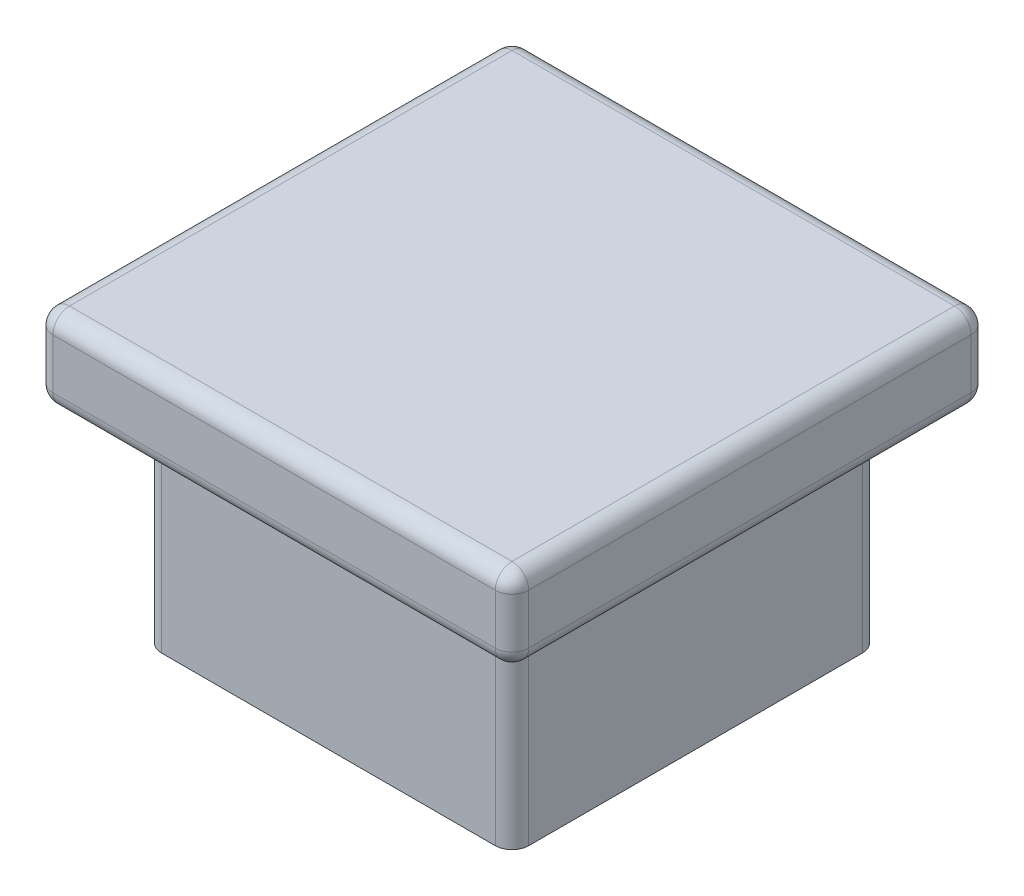
ISO-10303-21;
HEADER;
FILE_DESCRIPTION(('STEP AP214'),'2;1');
FILE_NAME('part.step','',(''),(''),'','','');
FILE_SCHEMA(('AUTOMOTIVE_DESIGN { 1 0 10303 214 1 1 1 1 }'));
ENDSEC;
DATA;
#1=APPLICATION_CONTEXT('core data for automotive mechanical design processes');
#2=APPLICATION_PROTOCOL_DEFINITION('international standard','automotive_design',2000,#1);
#3=PRODUCT_CONTEXT('',#1,'mechanical');
#4=PRODUCT('Part','Part','',(#3));
#5=PRODUCT_RELATED_PRODUCT_CATEGORY('part','',(#4));
#6=PRODUCT_DEFINITION_FORMATION('','',#4);
#7=PRODUCT_DEFINITION_CONTEXT('part definition',#1,'design');
#8=PRODUCT_DEFINITION('design','',#6,#7);
#9=PRODUCT_DEFINITION_SHAPE('','',#8);
#10=(LENGTH_UNIT() NAMED_UNIT(*) SI_UNIT(.MILLI.,.METRE.));
#11=(NAMED_UNIT(*) PLANE_ANGLE_UNIT() SI_UNIT($,.RADIAN.));
#12=(NAMED_UNIT(*) SI_UNIT($,.STERADIAN.) SOLID_ANGLE_UNIT());
#13=UNCERTAINTY_MEASURE_WITH_UNIT(LENGTH_MEASURE(1.E-05),#10,'distance_accuracy_value','');
#14=(GEOMETRIC_REPRESENTATION_CONTEXT(3) GLOBAL_UNCERTAINTY_ASSIGNED_CONTEXT((#13)) GLOBAL_UNIT_ASSIGNED_CONTEXT((#10,
#11,#12)) REPRESENTATION_CONTEXT('',''));
#15=CARTESIAN_POINT('',(0.,0.,0.));
#16=DIRECTION('',(0.,0.,1.));
#17=DIRECTION('',(1.,0.,0.));
#18=AXIS2_PLACEMENT_3D('',#15,#16,#17);
#19=CARTESIAN_POINT('',(0.,0.,0.));
#20=DIRECTION('',(0.,-1.,0.));
#21=DIRECTION('',(0.,0.,-1.));
#22=AXIS2_PLACEMENT_3D('',#19,#20,#21);
#23=PLANE('',#22);
#24=DIRECTION('',(0.,0.,-1.));
#25=VECTOR('',#24,1.);
#26=CARTESIAN_POINT('',(22.,0.,22.));
#27=LINE('',#26,#25);
#28=CARTESIAN_POINT('',(22.,0.,20.));
#29=VERTEX_POINT('',#28);
#30=CARTESIAN_POINT('',(22.,0.,-20.));
#31=VERTEX_POINT('',#30);
#32=EDGE_CURVE('E334',#29,#31,#27,.T.);
#33=ORIENTED_EDGE('',*,*,#32,.F.);
#34=CARTESIAN_POINT('',(20.,0.,20.));
#35=DIRECTION('',(0.,-1.,0.));
#36=DIRECTION('',(0.,0.,-1.));
#37=AXIS2_PLACEMENT_3D('',#34,#35,#36);
#38=CIRCLE('',#37,2.);
#39=CARTESIAN_POINT('',(20.,0.,22.));
#40=VERTEX_POINT('',#39);
#41=EDGE_CURVE('E443',#29,#40,#38,.T.);
#42=ORIENTED_EDGE('',*,*,#41,.T.);
#43=DIRECTION('',(1.,0.,0.));
#44=VECTOR('',#43,1.);
#45=CARTESIAN_POINT('',(-22.,0.,22.));
#46=LINE('',#45,#44);
#47=CARTESIAN_POINT('',(-20.,0.,22.));
#48=VERTEX_POINT('',#47);
#49=EDGE_CURVE('E345',#48,#40,#46,.T.);
#50=ORIENTED_EDGE('',*,*,#49,.F.);
#51=CARTESIAN_POINT('',(-20.,0.,20.));
#52=DIRECTION('',(0.,-1.,0.));
#53=DIRECTION('',(0.,0.,-1.));
#54=AXIS2_PLACEMENT_3D('',#51,#52,#53);
#55=CIRCLE('',#54,2.);
#56=CARTESIAN_POINT('',(-22.,0.,20.));
#57=VERTEX_POINT('',#56);
#58=EDGE_CURVE('E440',#48,#57,#55,.T.);
#59=ORIENTED_EDGE('',*,*,#58,.T.);
#60=DIRECTION('',(0.,0.,1.));
#61=VECTOR('',#60,1.);
#62=CARTESIAN_POINT('',(-22.,0.,22.));
#63=LINE('',#62,#61);
#64=CARTESIAN_POINT('',(-22.,0.,-20.));
#65=VERTEX_POINT('',#64);
#66=EDGE_CURVE('E341',#65,#57,#63,.T.);
#67=ORIENTED_EDGE('',*,*,#66,.F.);
#68=CARTESIAN_POINT('',(-20.,0.,-20.));
#69=DIRECTION('',(0.,-1.,0.));
#70=DIRECTION('',(0.,0.,-1.));
#71=AXIS2_PLACEMENT_3D('',#68,#69,#70);
#72=CIRCLE('',#71,2.);
#73=CARTESIAN_POINT('',(-20.,0.,-22.));
#74=VERTEX_POINT('',#73);
#75=EDGE_CURVE('E434',#65,#74,#72,.T.);
#76=ORIENTED_EDGE('',*,*,#75,.T.);
#77=DIRECTION('',(-1.,0.,0.));
#78=VECTOR('',#77,1.);
#79=CARTESIAN_POINT('',(-22.,0.,-22.));
#80=LINE('',#79,#78);
#81=CARTESIAN_POINT('',(20.,0.,-22.));
#82=VERTEX_POINT('',#81);
#83=EDGE_CURVE('E338',#82,#74,#80,.T.);
#84=ORIENTED_EDGE('',*,*,#83,.F.);
#85=CARTESIAN_POINT('',(20.,0.,-20.));
#86=DIRECTION('',(0.,-1.,0.));
#87=DIRECTION('',(0.,0.,-1.));
#88=AXIS2_PLACEMENT_3D('',#85,#86,#87);
#89=CIRCLE('',#88,2.);
#90=EDGE_CURVE('E437',#82,#31,#89,.T.);
#91=ORIENTED_EDGE('',*,*,#90,.T.);
#92=EDGE_LOOP('',(#33,#42,#50,#59,#67,#76,#84,#91));
#93=FACE_BOUND('',#92,.T.);
#94=DIRECTION('',(1.,0.,0.));
#95=VECTOR('',#94,1.);
#96=CARTESIAN_POINT('',(-19.,0.,19.));
#97=LINE('',#96,#95);
#98=CARTESIAN_POINT('',(-19.,0.,19.));
#99=VERTEX_POINT('',#98);
#100=CARTESIAN_POINT('',(19.,0.,19.));
#101=VERTEX_POINT('',#100);
#102=EDGE_CURVE('E294',#99,#101,#97,.T.);
#103=ORIENTED_EDGE('',*,*,#102,.T.);
#104=DIRECTION('',(0.,0.,-1.));
#105=VECTOR('',#104,1.);
#106=CARTESIAN_POINT('',(19.,0.,19.));
#107=LINE('',#106,#105);
#108=CARTESIAN_POINT('',(19.,0.,-19.));
#109=VERTEX_POINT('',#108);
#110=EDGE_CURVE('E283',#101,#109,#107,.T.);
#111=ORIENTED_EDGE('',*,*,#110,.T.);
#112=DIRECTION('',(-1.,0.,0.));
#113=VECTOR('',#112,1.);
#114=CARTESIAN_POINT('',(-19.,0.,-19.));
#115=LINE('',#114,#113);
#116=CARTESIAN_POINT('',(-19.,0.,-19.));
#117=VERTEX_POINT('',#116);
#118=EDGE_CURVE('E310',#109,#117,#115,.T.);
#119=ORIENTED_EDGE('',*,*,#118,.T.);
#120=DIRECTION('',(0.,0.,1.));
#121=VECTOR('',#120,1.);
#122=CARTESIAN_POINT('',(-19.,0.,19.));
#123=LINE('',#122,#121);
#124=EDGE_CURVE('E314',#117,#99,#123,.T.);
#125=ORIENTED_EDGE('',*,*,#124,.T.);
#126=EDGE_LOOP('',(#103,#111,#119,#125));
#127=FACE_BOUND('',#126,.T.);
#128=ADVANCED_FACE('F43',(#93,#127),#23,.T.);
#129=CARTESIAN_POINT('',(22.,25.,22.));
#130=DIRECTION('',(-1.,0.,0.));
#131=DIRECTION('',(0.,0.,1.));
#132=AXIS2_PLACEMENT_3D('',#129,#130,#131);
#133=PLANE('',#132);
#134=DIRECTION('',(0.,0.,1.));
#135=VECTOR('',#134,1.);
#136=CARTESIAN_POINT('',(22.,29.,-22.));
#137=LINE('',#136,#135);
#138=CARTESIAN_POINT('',(22.,29.,-20.));
#139=VERTEX_POINT('',#138);
#140=CARTESIAN_POINT('',(22.,29.,20.));
#141=VERTEX_POINT('',#140);
#142=EDGE_CURVE('E564',#139,#141,#137,.T.);
#143=ORIENTED_EDGE('',*,*,#142,.T.);
#144=DIRECTION('',(0.,-1.,0.));
#145=VECTOR('',#144,1.);
#146=CARTESIAN_POINT('',(22.,25.,20.));
#147=LINE('',#146,#145);
#148=EDGE_CURVE('E430',#141,#29,#147,.T.);
#149=ORIENTED_EDGE('',*,*,#148,.T.);
#150=ORIENTED_EDGE('',*,*,#32,.T.);
#151=DIRECTION('',(0.,-1.,0.));
#152=VECTOR('',#151,1.);
#153=CARTESIAN_POINT('',(22.,25.,-20.));
#154=LINE('',#153,#152);
#155=EDGE_CURVE('E427',#31,#139,#154,.F.);
#156=ORIENTED_EDGE('',*,*,#155,.T.);
#157=EDGE_LOOP('',(#143,#149,#150,#156));
#158=FACE_BOUND('',#157,.T.);
#159=ADVANCED_FACE('F596',(#158),#133,.F.);
#160=CARTESIAN_POINT('',(-22.,25.,-22.));
#161=DIRECTION('',(0.,0.,1.));
#162=DIRECTION('',(1.,0.,0.));
#163=AXIS2_PLACEMENT_3D('',#160,#161,#162);
#164=PLANE('',#163);
#165=DIRECTION('',(1.,0.,0.));
#166=VECTOR('',#165,1.);
#167=CARTESIAN_POINT('',(-22.,29.,-22.));
#168=LINE('',#167,#166);
#169=CARTESIAN_POINT('',(-20.,29.,-22.));
#170=VERTEX_POINT('',#169);
#171=CARTESIAN_POINT('',(20.,29.,-22.));
#172=VERTEX_POINT('',#171);
#173=EDGE_CURVE('E265',#170,#172,#168,.T.);
#174=ORIENTED_EDGE('',*,*,#173,.T.);
#175=DIRECTION('',(0.,-1.,0.));
#176=VECTOR('',#175,1.);
#177=CARTESIAN_POINT('',(20.,25.,-22.));
#178=LINE('',#177,#176);
#179=EDGE_CURVE('E462',#172,#82,#178,.T.);
#180=ORIENTED_EDGE('',*,*,#179,.T.);
#181=ORIENTED_EDGE('',*,*,#83,.T.);
#182=DIRECTION('',(0.,-1.,0.));
#183=VECTOR('',#182,1.);
#184=CARTESIAN_POINT('',(-20.,25.,-22.));
#185=LINE('',#184,#183);
#186=EDGE_CURVE('E67',#74,#170,#185,.F.);
#187=ORIENTED_EDGE('',*,*,#186,.T.);
#188=EDGE_LOOP('',(#174,#180,#181,#187));
#189=FACE_BOUND('',#188,.T.);
#190=ADVANCED_FACE('F587',(#189),#164,.F.);
#191=CARTESIAN_POINT('',(-22.,25.,22.));
#192=DIRECTION('',(1.,0.,0.));
#193=DIRECTION('',(0.,0.,-1.));
#194=AXIS2_PLACEMENT_3D('',#191,#192,#193);
#195=PLANE('',#194);
#196=ORIENTED_EDGE('',*,*,#66,.T.);
#197=DIRECTION('',(0.,-1.,0.));
#198=VECTOR('',#197,1.);
#199=CARTESIAN_POINT('',(-22.,25.,20.));
#200=LINE('',#199,#198);
#201=CARTESIAN_POINT('',(-22.,29.,20.));
#202=VERTEX_POINT('',#201);
#203=EDGE_CURVE('E457',#57,#202,#200,.F.);
#204=ORIENTED_EDGE('',*,*,#203,.T.);
#205=DIRECTION('',(0.,0.,-1.));
#206=VECTOR('',#205,1.);
#207=CARTESIAN_POINT('',(-22.,29.,-22.));
#208=LINE('',#207,#206);
#209=CARTESIAN_POINT('',(-22.,29.,-20.));
#210=VERTEX_POINT('',#209);
#211=EDGE_CURVE('E578',#202,#210,#208,.T.);
#212=ORIENTED_EDGE('',*,*,#211,.T.);
#213=DIRECTION('',(0.,-1.,0.));
#214=VECTOR('',#213,1.);
#215=CARTESIAN_POINT('',(-22.,25.,-20.));
#216=LINE('',#215,#214);
#217=EDGE_CURVE('E453',#210,#65,#216,.T.);
#218=ORIENTED_EDGE('',*,*,#217,.T.);
#219=EDGE_LOOP('',(#196,#204,#212,#218));
#220=FACE_BOUND('',#219,.T.);
#221=ADVANCED_FACE('F611',(#220),#195,.F.);
#222=CARTESIAN_POINT('',(-22.,25.,22.));
#223=DIRECTION('',(0.,0.,-1.));
#224=DIRECTION('',(-1.,0.,0.));
#225=AXIS2_PLACEMENT_3D('',#222,#223,#224);
#226=PLANE('',#225);
#227=ORIENTED_EDGE('',*,*,#49,.T.);
#228=DIRECTION('',(0.,-1.,0.));
#229=VECTOR('',#228,1.);
#230=CARTESIAN_POINT('',(20.,25.,22.));
#231=LINE('',#230,#229);
#232=CARTESIAN_POINT('',(20.,29.,22.));
#233=VERTEX_POINT('',#232);
#234=EDGE_CURVE('E450',#40,#233,#231,.F.);
#235=ORIENTED_EDGE('',*,*,#234,.T.);
#236=DIRECTION('',(-1.,0.,0.));
#237=VECTOR('',#236,1.);
#238=CARTESIAN_POINT('',(-22.,29.,22.));
#239=LINE('',#238,#237);
#240=CARTESIAN_POINT('',(-20.,29.,22.));
#241=VERTEX_POINT('',#240);
#242=EDGE_CURVE('E572',#233,#241,#239,.T.);
#243=ORIENTED_EDGE('',*,*,#242,.T.);
#244=DIRECTION('',(0.,-1.,0.));
#245=VECTOR('',#244,1.);
#246=CARTESIAN_POINT('',(-20.,25.,22.));
#247=LINE('',#246,#245);
#248=EDGE_CURVE('E446',#241,#48,#247,.T.);
#249=ORIENTED_EDGE('',*,*,#248,.T.);
#250=EDGE_LOOP('',(#227,#235,#243,#249));
#251=FACE_BOUND('',#250,.T.);
#252=ADVANCED_FACE('F603',(#251),#226,.F.);
#253=CARTESIAN_POINT('',(19.,25.,19.));
#254=DIRECTION('',(-1.,0.,0.));
#255=DIRECTION('',(0.,0.,1.));
#256=AXIS2_PLACEMENT_3D('',#253,#254,#255);
#257=PLANE('',#256);
#258=ORIENTED_EDGE('',*,*,#110,.F.);
#259=DIRECTION('',(0.,-1.,0.));
#260=VECTOR('',#259,1.);
#261=CARTESIAN_POINT('',(19.,25.,19.));
#262=LINE('',#261,#260);
#263=CARTESIAN_POINT('',(19.,25.,19.));
#264=VERTEX_POINT('',#263);
#265=EDGE_CURVE('E306',#264,#101,#262,.T.);
#266=ORIENTED_EDGE('',*,*,#265,.F.);
#267=DIRECTION('',(0.,0.,-1.));
#268=VECTOR('',#267,1.);
#269=CARTESIAN_POINT('',(19.,25.,19.));
#270=LINE('',#269,#268);
#271=CARTESIAN_POINT('',(19.,25.,-19.));
#272=VERTEX_POINT('',#271);
#273=EDGE_CURVE('E289',#264,#272,#270,.T.);
#274=ORIENTED_EDGE('',*,*,#273,.T.);
#275=DIRECTION('',(0.,-1.,0.));
#276=VECTOR('',#275,1.);
#277=CARTESIAN_POINT('',(19.,25.,-19.));
#278=LINE('',#277,#276);
#279=EDGE_CURVE('E330',#272,#109,#278,.T.);
#280=ORIENTED_EDGE('',*,*,#279,.T.);
#281=EDGE_LOOP('',(#258,#266,#274,#280));
#282=FACE_BOUND('',#281,.T.);
#283=ADVANCED_FACE('F634',(#282),#257,.T.);
#284=CARTESIAN_POINT('',(-19.,25.,-19.));
#285=DIRECTION('',(0.,0.,1.));
#286=DIRECTION('',(1.,0.,0.));
#287=AXIS2_PLACEMENT_3D('',#284,#285,#286);
#288=PLANE('',#287);
#289=ORIENTED_EDGE('',*,*,#118,.F.);
#290=ORIENTED_EDGE('',*,*,#279,.F.);
#291=DIRECTION('',(-1.,0.,0.));
#292=VECTOR('',#291,1.);
#293=CARTESIAN_POINT('',(-19.,25.,-19.));
#294=LINE('',#293,#292);
#295=CARTESIAN_POINT('',(-19.,25.,-19.));
#296=VERTEX_POINT('',#295);
#297=EDGE_CURVE('E293',#272,#296,#294,.T.);
#298=ORIENTED_EDGE('',*,*,#297,.T.);
#299=DIRECTION('',(0.,-1.,0.));
#300=VECTOR('',#299,1.);
#301=CARTESIAN_POINT('',(-19.,25.,-19.));
#302=LINE('',#301,#300);
#303=EDGE_CURVE('E327',#296,#117,#302,.T.);
#304=ORIENTED_EDGE('',*,*,#303,.T.);
#305=EDGE_LOOP('',(#289,#290,#298,#304));
#306=FACE_BOUND('',#305,.T.);
#307=ADVANCED_FACE('F1056',(#306),#288,.T.);
#308=CARTESIAN_POINT('',(-19.,25.,19.));
#309=DIRECTION('',(1.,0.,0.));
#310=DIRECTION('',(0.,0.,-1.));
#311=AXIS2_PLACEMENT_3D('',#308,#309,#310);
#312=PLANE('',#311);
#313=ORIENTED_EDGE('',*,*,#124,.F.);
#314=ORIENTED_EDGE('',*,*,#303,.F.);
#315=DIRECTION('',(0.,0.,1.));
#316=VECTOR('',#315,1.);
#317=CARTESIAN_POINT('',(-19.,25.,19.));
#318=LINE('',#317,#316);
#319=CARTESIAN_POINT('',(-19.,25.,19.));
#320=VERTEX_POINT('',#319);
#321=EDGE_CURVE('E298',#296,#320,#318,.T.);
#322=ORIENTED_EDGE('',*,*,#321,.T.);
#323=DIRECTION('',(0.,-1.,0.));
#324=VECTOR('',#323,1.);
#325=CARTESIAN_POINT('',(-19.,25.,19.));
#326=LINE('',#325,#324);
#327=EDGE_CURVE('E324',#320,#99,#326,.T.);
#328=ORIENTED_EDGE('',*,*,#327,.T.);
#329=EDGE_LOOP('',(#313,#314,#322,#328));
#330=FACE_BOUND('',#329,.T.);
#331=ADVANCED_FACE('F1045',(#330),#312,.T.);
#332=CARTESIAN_POINT('',(-19.,25.,19.));
#333=DIRECTION('',(0.,0.,-1.));
#334=DIRECTION('',(-1.,0.,0.));
#335=AXIS2_PLACEMENT_3D('',#332,#333,#334);
#336=PLANE('',#335);
#337=ORIENTED_EDGE('',*,*,#102,.F.);
#338=ORIENTED_EDGE('',*,*,#327,.F.);
#339=DIRECTION('',(1.,0.,0.));
#340=VECTOR('',#339,1.);
#341=CARTESIAN_POINT('',(-19.,25.,19.));
#342=LINE('',#341,#340);
#343=EDGE_CURVE('E302',#320,#264,#342,.T.);
#344=ORIENTED_EDGE('',*,*,#343,.T.);
#345=ORIENTED_EDGE('',*,*,#265,.T.);
#346=EDGE_LOOP('',(#337,#338,#344,#345));
#347=FACE_BOUND('',#346,.T.);
#348=ADVANCED_FACE('F1035',(#347),#336,.T.);
#349=CARTESIAN_POINT('',(0.,25.,0.));
#350=DIRECTION('',(0.,-1.,0.));
#351=DIRECTION('',(0.,0.,-1.));
#352=AXIS2_PLACEMENT_3D('',#349,#350,#351);
#353=PLANE('',#352);
#354=ORIENTED_EDGE('',*,*,#273,.F.);
#355=ORIENTED_EDGE('',*,*,#343,.F.);
#356=ORIENTED_EDGE('',*,*,#321,.F.);
#357=ORIENTED_EDGE('',*,*,#297,.F.);
#358=EDGE_LOOP('',(#354,#355,#356,#357));
#359=FACE_BOUND('',#358,.T.);
#360=ADVANCED_FACE('F903',(#359),#353,.T.);
#361=CARTESIAN_POINT('',(25.75,29.,-25.75));
#362=DIRECTION('',(1.,0.,0.));
#363=DIRECTION('',(0.,0.,-1.));
#364=AXIS2_PLACEMENT_3D('',#361,#362,#363);
#365=PLANE('',#364);
#366=DIRECTION('',(0.,0.,1.));
#367=VECTOR('',#366,1.);
#368=CARTESIAN_POINT('',(25.75,25.,-25.75));
#369=LINE('',#368,#367);
#370=CARTESIAN_POINT('',(25.75,25.,-25.75));
#371=VERTEX_POINT('',#370);
#372=CARTESIAN_POINT('',(25.75,25.,25.75));
#373=VERTEX_POINT('',#372);
#374=EDGE_CURVE('E238',#371,#373,#369,.T.);
#375=ORIENTED_EDGE('',*,*,#374,.T.);
#376=DIRECTION('',(0.,-1.,0.));
#377=VECTOR('',#376,1.);
#378=CARTESIAN_POINT('',(25.75,29.,25.75));
#379=LINE('',#378,#377);
#380=CARTESIAN_POINT('',(25.75,29.,25.75));
#381=VERTEX_POINT('',#380);
#382=EDGE_CURVE('E231',#381,#373,#379,.T.);
#383=ORIENTED_EDGE('',*,*,#382,.F.);
#384=DIRECTION('',(0.,0.,1.));
#385=VECTOR('',#384,1.);
#386=CARTESIAN_POINT('',(25.75,29.,-25.75));
#387=LINE('',#386,#385);
#388=CARTESIAN_POINT('',(25.75,29.,-25.75));
#389=VERTEX_POINT('',#388);
#390=EDGE_CURVE('E235',#389,#381,#387,.T.);
#391=ORIENTED_EDGE('',*,*,#390,.F.);
#392=DIRECTION('',(0.,-1.,0.));
#393=VECTOR('',#392,1.);
#394=CARTESIAN_POINT('',(25.75,29.,-25.75));
#395=LINE('',#394,#393);
#396=EDGE_CURVE('E280',#389,#371,#395,.T.);
#397=ORIENTED_EDGE('',*,*,#396,.T.);
#398=EDGE_LOOP('',(#375,#383,#391,#397));
#399=FACE_BOUND('',#398,.T.);
#400=ADVANCED_FACE('F233',(#399),#365,.F.);
#401=CARTESIAN_POINT('',(-25.75,29.,-25.75));
#402=DIRECTION('',(0.,0.,-1.));
#403=DIRECTION('',(-1.,0.,0.));
#404=AXIS2_PLACEMENT_3D('',#401,#402,#403);
#405=PLANE('',#404);
#406=DIRECTION('',(1.,0.,0.));
#407=VECTOR('',#406,1.);
#408=CARTESIAN_POINT('',(-25.75,25.,-25.75));
#409=LINE('',#408,#407);
#410=CARTESIAN_POINT('',(-25.75,25.,-25.75));
#411=VERTEX_POINT('',#410);
#412=EDGE_CURVE('E258',#411,#371,#409,.T.);
#413=ORIENTED_EDGE('',*,*,#412,.T.);
#414=ORIENTED_EDGE('',*,*,#396,.F.);
#415=DIRECTION('',(1.,0.,0.));
#416=VECTOR('',#415,1.);
#417=CARTESIAN_POINT('',(-25.75,29.,-25.75));
#418=LINE('',#417,#416);
#419=CARTESIAN_POINT('',(-25.75,29.,-25.75));
#420=VERTEX_POINT('',#419);
#421=EDGE_CURVE('E244',#420,#389,#418,.T.);
#422=ORIENTED_EDGE('',*,*,#421,.F.);
#423=DIRECTION('',(0.,-1.,0.));
#424=VECTOR('',#423,1.);
#425=CARTESIAN_POINT('',(-25.75,29.,-25.75));
#426=LINE('',#425,#424);
#427=EDGE_CURVE('E284',#420,#411,#426,.T.);
#428=ORIENTED_EDGE('',*,*,#427,.T.);
#429=EDGE_LOOP('',(#413,#414,#422,#428));
#430=FACE_BOUND('',#429,.T.);
#431=ADVANCED_FACE('F1008',(#430),#405,.F.);
#432=CARTESIAN_POINT('',(-25.75,29.,-25.75));
#433=DIRECTION('',(-1.,0.,0.));
#434=DIRECTION('',(0.,0.,1.));
#435=AXIS2_PLACEMENT_3D('',#432,#433,#434);
#436=PLANE('',#435);
#437=DIRECTION('',(0.,0.,-1.));
#438=VECTOR('',#437,1.);
#439=CARTESIAN_POINT('',(-25.75,25.,-25.75));
#440=LINE('',#439,#438);
#441=CARTESIAN_POINT('',(-25.75,25.,25.75));
#442=VERTEX_POINT('',#441);
#443=EDGE_CURVE('E262',#442,#411,#440,.T.);
#444=ORIENTED_EDGE('',*,*,#443,.T.);
#445=ORIENTED_EDGE('',*,*,#427,.F.);
#446=DIRECTION('',(0.,0.,-1.));
#447=VECTOR('',#446,1.);
#448=CARTESIAN_POINT('',(-25.75,29.,-25.75));
#449=LINE('',#448,#447);
#450=CARTESIAN_POINT('',(-25.75,29.,25.75));
#451=VERTEX_POINT('',#450);
#452=EDGE_CURVE('E253',#451,#420,#449,.T.);
#453=ORIENTED_EDGE('',*,*,#452,.F.);
#454=DIRECTION('',(0.,-1.,0.));
#455=VECTOR('',#454,1.);
#456=CARTESIAN_POINT('',(-25.75,29.,25.75));
#457=LINE('',#456,#455);
#458=EDGE_CURVE('E243',#451,#442,#457,.T.);
#459=ORIENTED_EDGE('',*,*,#458,.T.);
#460=EDGE_LOOP('',(#444,#445,#453,#459));
#461=FACE_BOUND('',#460,.T.);
#462=ADVANCED_FACE('F623',(#461),#436,.F.);
#463=CARTESIAN_POINT('',(-25.75,29.,25.75));
#464=DIRECTION('',(0.,0.,1.));
#465=DIRECTION('',(1.,0.,0.));
#466=AXIS2_PLACEMENT_3D('',#463,#464,#465);
#467=PLANE('',#466);
#468=DIRECTION('',(-1.,0.,0.));
#469=VECTOR('',#468,1.);
#470=CARTESIAN_POINT('',(-25.75,25.,25.75));
#471=LINE('',#470,#469);
#472=EDGE_CURVE('E274',#373,#442,#471,.T.);
#473=ORIENTED_EDGE('',*,*,#472,.T.);
#474=ORIENTED_EDGE('',*,*,#458,.F.);
#475=DIRECTION('',(-1.,0.,0.));
#476=VECTOR('',#475,1.);
#477=CARTESIAN_POINT('',(-25.75,29.,25.75));
#478=LINE('',#477,#476);
#479=EDGE_CURVE('E247',#381,#451,#478,.T.);
#480=ORIENTED_EDGE('',*,*,#479,.F.);
#481=ORIENTED_EDGE('',*,*,#382,.T.);
#482=EDGE_LOOP('',(#473,#474,#480,#481));
#483=FACE_BOUND('',#482,.T.);
#484=ADVANCED_FACE('F248',(#483),#467,.F.);
#485=CARTESIAN_POINT('',(0.,29.,0.));
#486=DIRECTION('',(0.,1.,0.));
#487=DIRECTION('',(0.,0.,1.));
#488=AXIS2_PLACEMENT_3D('',#485,#486,#487);
#489=PLANE('',#488);
#490=ORIENTED_EDGE('',*,*,#142,.F.);
#491=CARTESIAN_POINT('',(20.,29.,-20.));
#492=DIRECTION('',(0.,1.,0.));
#493=DIRECTION('',(0.,0.,1.));
#494=AXIS2_PLACEMENT_3D('',#491,#492,#493);
#495=CIRCLE('',#494,2.);
#496=EDGE_CURVE('E53',#139,#172,#495,.T.);
#497=ORIENTED_EDGE('',*,*,#496,.T.);
#498=ORIENTED_EDGE('',*,*,#173,.F.);
#499=CARTESIAN_POINT('',(-20.,29.,-20.));
#500=DIRECTION('',(0.,1.,0.));
#501=DIRECTION('',(0.,0.,1.));
#502=AXIS2_PLACEMENT_3D('',#499,#500,#501);
#503=CIRCLE('',#502,2.);
#504=EDGE_CURVE('E11',#170,#210,#503,.T.);
#505=ORIENTED_EDGE('',*,*,#504,.T.);
#506=ORIENTED_EDGE('',*,*,#211,.F.);
#507=CARTESIAN_POINT('',(-20.,29.,20.));
#508=DIRECTION('',(0.,1.,0.));
#509=DIRECTION('',(0.,0.,1.));
#510=AXIS2_PLACEMENT_3D('',#507,#508,#509);
#511=CIRCLE('',#510,2.);
#512=EDGE_CURVE('E469',#202,#241,#511,.T.);
#513=ORIENTED_EDGE('',*,*,#512,.T.);
#514=ORIENTED_EDGE('',*,*,#242,.F.);
#515=CARTESIAN_POINT('',(20.,29.,20.));
#516=DIRECTION('',(0.,1.,0.));
#517=DIRECTION('',(0.,0.,1.));
#518=AXIS2_PLACEMENT_3D('',#515,#516,#517);
#519=CIRCLE('',#518,2.);
#520=EDGE_CURVE('E466',#233,#141,#519,.T.);
#521=ORIENTED_EDGE('',*,*,#520,.T.);
#522=EDGE_LOOP('',(#490,#497,#498,#505,#506,#513,#514,#521));
#523=FACE_BOUND('',#522,.T.);
#524=ORIENTED_EDGE('',*,*,#390,.T.);
#525=ORIENTED_EDGE('',*,*,#479,.T.);
#526=ORIENTED_EDGE('',*,*,#452,.T.);
#527=ORIENTED_EDGE('',*,*,#421,.T.);
#528=EDGE_LOOP('',(#524,#525,#526,#527));
#529=FACE_BOUND('',#528,.T.);
#530=ADVANCED_FACE('F255',(#523,#529),#489,.F.);
#531=CARTESIAN_POINT('',(0.,35.,0.));
#532=DIRECTION('',(0.,-1.,0.));
#533=DIRECTION('',(0.,0.,-1.));
#534=AXIS2_PLACEMENT_3D('',#531,#532,#533);
#535=PLANE('',#534);
#536=DIRECTION('',(0.,0.,1.));
#537=VECTOR('',#536,1.);
#538=CARTESIAN_POINT('',(-26.5,35.,0.));
#539=LINE('',#538,#537);
#540=CARTESIAN_POINT('',(-26.5,35.,-26.5));
#541=VERTEX_POINT('',#540);
#542=CARTESIAN_POINT('',(-26.5,35.,26.5));
#543=VERTEX_POINT('',#542);
#544=EDGE_CURVE('E355',#541,#543,#539,.T.);
#545=ORIENTED_EDGE('',*,*,#544,.T.);
#546=DIRECTION('',(1.,0.,0.));
#547=VECTOR('',#546,1.);
#548=CARTESIAN_POINT('',(0.,35.,26.5));
#549=LINE('',#548,#547);
#550=CARTESIAN_POINT('',(26.5,35.,26.5));
#551=VERTEX_POINT('',#550);
#552=EDGE_CURVE('E358',#543,#551,#549,.T.);
#553=ORIENTED_EDGE('',*,*,#552,.T.);
#554=DIRECTION('',(0.,0.,-1.));
#555=VECTOR('',#554,1.);
#556=CARTESIAN_POINT('',(26.5,35.,0.));
#557=LINE('',#556,#555);
#558=CARTESIAN_POINT('',(26.5,35.,-26.5));
#559=VERTEX_POINT('',#558);
#560=EDGE_CURVE('E349',#551,#559,#557,.T.);
#561=ORIENTED_EDGE('',*,*,#560,.T.);
#562=DIRECTION('',(-1.,0.,0.));
#563=VECTOR('',#562,1.);
#564=CARTESIAN_POINT('',(0.,35.,-26.5));
#565=LINE('',#564,#563);
#566=EDGE_CURVE('E352',#559,#541,#565,.T.);
#567=ORIENTED_EDGE('',*,*,#566,.T.);
#568=EDGE_LOOP('',(#545,#553,#561,#567));
#569=FACE_BOUND('',#568,.T.);
#570=ADVANCED_FACE('F614',(#569),#535,.F.);
#571=CARTESIAN_POINT('',(-28.5,35.,-28.5));
#572=DIRECTION('',(0.,0.,1.));
#573=DIRECTION('',(1.,0.,0.));
#574=AXIS2_PLACEMENT_3D('',#571,#572,#573);
#575=PLANE('',#574);
#576=DIRECTION('',(-1.,0.,0.));
#577=VECTOR('',#576,1.);
#578=CARTESIAN_POINT('',(-28.5,27.,-28.5));
#579=LINE('',#578,#577);
#580=CARTESIAN_POINT('',(26.5,27.,-28.5));
#581=VERTEX_POINT('',#580);
#582=CARTESIAN_POINT('',(-26.5,27.,-28.5));
#583=VERTEX_POINT('',#582);
#584=EDGE_CURVE('E391',#581,#583,#579,.T.);
#585=ORIENTED_EDGE('',*,*,#584,.T.);
#586=DIRECTION('',(0.,-1.,0.));
#587=VECTOR('',#586,1.);
#588=CARTESIAN_POINT('',(-26.5,35.,-28.5));
#589=LINE('',#588,#587);
#590=CARTESIAN_POINT('',(-26.5,33.,-28.5));
#591=VERTEX_POINT('',#590);
#592=EDGE_CURVE('E398',#583,#591,#589,.F.);
#593=ORIENTED_EDGE('',*,*,#592,.T.);
#594=DIRECTION('',(-1.,0.,0.));
#595=VECTOR('',#594,1.);
#596=CARTESIAN_POINT('',(-28.5,33.,-28.5));
#597=LINE('',#596,#595);
#598=CARTESIAN_POINT('',(26.5,33.,-28.5));
#599=VERTEX_POINT('',#598);
#600=EDGE_CURVE('E394',#591,#599,#597,.F.);
#601=ORIENTED_EDGE('',*,*,#600,.T.);
#602=DIRECTION('',(0.,-1.,0.));
#603=VECTOR('',#602,1.);
#604=CARTESIAN_POINT('',(26.5,35.,-28.5));
#605=LINE('',#604,#603);
#606=EDGE_CURVE('E388',#599,#581,#605,.T.);
#607=ORIENTED_EDGE('',*,*,#606,.T.);
#608=EDGE_LOOP('',(#585,#593,#601,#607));
#609=FACE_BOUND('',#608,.T.);
#610=ADVANCED_FACE('F620',(#609),#575,.F.);
#611=CARTESIAN_POINT('',(-28.5,35.,28.5));
#612=DIRECTION('',(1.,0.,0.));
#613=DIRECTION('',(0.,0.,-1.));
#614=AXIS2_PLACEMENT_3D('',#611,#612,#613);
#615=PLANE('',#614);
#616=DIRECTION('',(0.,0.,1.));
#617=VECTOR('',#616,1.);
#618=CARTESIAN_POINT('',(-28.5,33.,28.5));
#619=LINE('',#618,#617);
#620=CARTESIAN_POINT('',(-28.5,33.,26.5));
#621=VERTEX_POINT('',#620);
#622=CARTESIAN_POINT('',(-28.5,33.,-26.5));
#623=VERTEX_POINT('',#622);
#624=EDGE_CURVE('E381',#621,#623,#619,.F.);
#625=ORIENTED_EDGE('',*,*,#624,.T.);
#626=DIRECTION('',(0.,-1.,0.));
#627=VECTOR('',#626,1.);
#628=CARTESIAN_POINT('',(-28.5,35.,-26.5));
#629=LINE('',#628,#627);
#630=CARTESIAN_POINT('',(-28.5,27.,-26.5));
#631=VERTEX_POINT('',#630);
#632=EDGE_CURVE('E385',#623,#631,#629,.T.);
#633=ORIENTED_EDGE('',*,*,#632,.T.);
#634=DIRECTION('',(0.,0.,1.));
#635=VECTOR('',#634,1.);
#636=CARTESIAN_POINT('',(-28.5,27.,28.5));
#637=LINE('',#636,#635);
#638=CARTESIAN_POINT('',(-28.5,27.,26.5));
#639=VERTEX_POINT('',#638);
#640=EDGE_CURVE('E378',#631,#639,#637,.T.);
#641=ORIENTED_EDGE('',*,*,#640,.T.);
#642=DIRECTION('',(0.,-1.,0.));
#643=VECTOR('',#642,1.);
#644=CARTESIAN_POINT('',(-28.5,35.,26.5));
#645=LINE('',#644,#643);
#646=EDGE_CURVE('E375',#639,#621,#645,.F.);
#647=ORIENTED_EDGE('',*,*,#646,.T.);
#648=EDGE_LOOP('',(#625,#633,#641,#647));
#649=FACE_BOUND('',#648,.T.);
#650=ADVANCED_FACE('F927',(#649),#615,.F.);
#651=CARTESIAN_POINT('',(-28.5,35.,28.5));
#652=DIRECTION('',(0.,0.,-1.));
#653=DIRECTION('',(-1.,0.,0.));
#654=AXIS2_PLACEMENT_3D('',#651,#652,#653);
#655=PLANE('',#654);
#656=DIRECTION('',(1.,0.,0.));
#657=VECTOR('',#656,1.);
#658=CARTESIAN_POINT('',(28.5,27.,28.5));
#659=LINE('',#658,#657);
#660=CARTESIAN_POINT('',(-26.5,27.,28.5));
#661=VERTEX_POINT('',#660);
#662=CARTESIAN_POINT('',(26.5,27.,28.5));
#663=VERTEX_POINT('',#662);
#664=EDGE_CURVE('E365',#661,#663,#659,.T.);
#665=ORIENTED_EDGE('',*,*,#664,.T.);
#666=DIRECTION('',(0.,-1.,0.));
#667=VECTOR('',#666,1.);
#668=CARTESIAN_POINT('',(26.5,35.,28.5));
#669=LINE('',#668,#667);
#670=CARTESIAN_POINT('',(26.5,33.,28.5));
#671=VERTEX_POINT('',#670);
#672=EDGE_CURVE('E372',#663,#671,#669,.F.);
#673=ORIENTED_EDGE('',*,*,#672,.T.);
#674=DIRECTION('',(1.,0.,0.));
#675=VECTOR('',#674,1.);
#676=CARTESIAN_POINT('',(-28.5,33.,28.5));
#677=LINE('',#676,#675);
#678=CARTESIAN_POINT('',(-26.5,33.,28.5));
#679=VERTEX_POINT('',#678);
#680=EDGE_CURVE('E368',#671,#679,#677,.F.);
#681=ORIENTED_EDGE('',*,*,#680,.T.);
#682=DIRECTION('',(0.,-1.,0.));
#683=VECTOR('',#682,1.);
#684=CARTESIAN_POINT('',(-26.5,35.,28.5));
#685=LINE('',#684,#683);
#686=EDGE_CURVE('E362',#679,#661,#685,.T.);
#687=ORIENTED_EDGE('',*,*,#686,.T.);
#688=EDGE_LOOP('',(#665,#673,#681,#687));
#689=FACE_BOUND('',#688,.T.);
#690=ADVANCED_FACE('F914',(#689),#655,.F.);
#691=CARTESIAN_POINT('',(28.5,35.,28.5));
#692=DIRECTION('',(-1.,0.,0.));
#693=DIRECTION('',(0.,0.,1.));
#694=AXIS2_PLACEMENT_3D('',#691,#692,#693);
#695=PLANE('',#694);
#696=DIRECTION('',(0.,0.,-1.));
#697=VECTOR('',#696,1.);
#698=CARTESIAN_POINT('',(28.5,27.,-28.5));
#699=LINE('',#698,#697);
#700=CARTESIAN_POINT('',(28.5,27.,26.5));
#701=VERTEX_POINT('',#700);
#702=CARTESIAN_POINT('',(28.5,27.,-26.5));
#703=VERTEX_POINT('',#702);
#704=EDGE_CURVE('E404',#701,#703,#699,.T.);
#705=ORIENTED_EDGE('',*,*,#704,.T.);
#706=DIRECTION('',(0.,-1.,0.));
#707=VECTOR('',#706,1.);
#708=CARTESIAN_POINT('',(28.5,35.,-26.5));
#709=LINE('',#708,#707);
#710=CARTESIAN_POINT('',(28.5,33.,-26.5));
#711=VERTEX_POINT('',#710);
#712=EDGE_CURVE('E411',#703,#711,#709,.F.);
#713=ORIENTED_EDGE('',*,*,#712,.T.);
#714=DIRECTION('',(0.,0.,-1.));
#715=VECTOR('',#714,1.);
#716=CARTESIAN_POINT('',(28.5,33.,28.5));
#717=LINE('',#716,#715);
#718=CARTESIAN_POINT('',(28.5,33.,26.5));
#719=VERTEX_POINT('',#718);
#720=EDGE_CURVE('E407',#711,#719,#717,.F.);
#721=ORIENTED_EDGE('',*,*,#720,.T.);
#722=DIRECTION('',(0.,-1.,0.));
#723=VECTOR('',#722,1.);
#724=CARTESIAN_POINT('',(28.5,35.,26.5));
#725=LINE('',#724,#723);
#726=EDGE_CURVE('E401',#719,#701,#725,.T.);
#727=ORIENTED_EDGE('',*,*,#726,.T.);
#728=EDGE_LOOP('',(#705,#713,#721,#727));
#729=FACE_BOUND('',#728,.T.);
#730=ADVANCED_FACE('F900',(#729),#695,.F.);
#731=DIRECTION('',(1.,0.,0.));
#732=VECTOR('',#731,1.);
#733=CARTESIAN_POINT('',(-28.5,25.,26.5));
#734=LINE('',#733,#732);
#735=CARTESIAN_POINT('',(26.5,25.,26.5));
#736=VERTEX_POINT('',#735);
#737=CARTESIAN_POINT('',(-26.5,25.,26.5));
#738=VERTEX_POINT('',#737);
#739=EDGE_CURVE('E414',#736,#738,#734,.F.);
#740=ORIENTED_EDGE('',*,*,#739,.T.);
#741=DIRECTION('',(0.,0.,1.));
#742=VECTOR('',#741,1.);
#743=CARTESIAN_POINT('',(-26.5,25.,-28.5));
#744=LINE('',#743,#742);
#745=CARTESIAN_POINT('',(-26.5,25.,-26.5));
#746=VERTEX_POINT('',#745);
#747=EDGE_CURVE('E423',#738,#746,#744,.F.);
#748=ORIENTED_EDGE('',*,*,#747,.T.);
#749=DIRECTION('',(-1.,0.,0.));
#750=VECTOR('',#749,1.);
#751=CARTESIAN_POINT('',(28.5,25.,-26.5));
#752=LINE('',#751,#750);
#753=CARTESIAN_POINT('',(26.5,25.,-26.5));
#754=VERTEX_POINT('',#753);
#755=EDGE_CURVE('E420',#746,#754,#752,.F.);
#756=ORIENTED_EDGE('',*,*,#755,.T.);
#757=DIRECTION('',(0.,0.,-1.));
#758=VECTOR('',#757,1.);
#759=CARTESIAN_POINT('',(26.5,25.,28.5));
#760=LINE('',#759,#758);
#761=EDGE_CURVE('E417',#754,#736,#760,.F.);
#762=ORIENTED_EDGE('',*,*,#761,.T.);
#763=EDGE_LOOP('',(#740,#748,#756,#762));
#764=FACE_BOUND('',#763,.T.);
#765=ORIENTED_EDGE('',*,*,#374,.F.);
#766=ORIENTED_EDGE('',*,*,#412,.F.);
#767=ORIENTED_EDGE('',*,*,#443,.F.);
#768=ORIENTED_EDGE('',*,*,#472,.F.);
#769=EDGE_LOOP('',(#765,#766,#767,#768));
#770=FACE_BOUND('',#769,.T.);
#771=ADVANCED_FACE('F719',(#764,#770),#353,.T.);
#772=CARTESIAN_POINT('',(-28.5,27.,-26.5));
#773=DIRECTION('',(1.,0.,0.));
#774=DIRECTION('',(0.,0.,-1.));
#775=AXIS2_PLACEMENT_3D('',#772,#773,#774);
#776=CYLINDRICAL_SURFACE('',#775,2.);
#777=CARTESIAN_POINT('',(-26.5,27.,-26.5));
#778=DIRECTION('',(-1.,0.,0.));
#779=DIRECTION('',(0.,0.,1.));
#780=AXIS2_PLACEMENT_3D('',#777,#778,#779);
#781=CIRCLE('',#780,2.);
#782=EDGE_CURVE('E47',#583,#746,#781,.T.);
#783=ORIENTED_EDGE('',*,*,#782,.F.);
#784=ORIENTED_EDGE('',*,*,#584,.F.);
#785=CARTESIAN_POINT('',(26.5,27.,-26.5));
#786=DIRECTION('',(1.,0.,0.));
#787=DIRECTION('',(0.,0.,-1.));
#788=AXIS2_PLACEMENT_3D('',#785,#786,#787);
#789=CIRCLE('',#788,2.);
#790=EDGE_CURVE('E555',#754,#581,#789,.T.);
#791=ORIENTED_EDGE('',*,*,#790,.F.);
#792=ORIENTED_EDGE('',*,*,#755,.F.);
#793=EDGE_LOOP('',(#783,#784,#791,#792));
#794=FACE_BOUND('',#793,.T.);
#795=ADVANCED_FACE('F716',(#794),#776,.T.);
#796=CARTESIAN_POINT('',(-26.5,27.,-26.5));
#797=DIRECTION('',(0.,-1.,0.));
#798=DIRECTION('',(0.,0.,-1.));
#799=AXIS2_PLACEMENT_3D('',#796,#797,#798);
#800=SPHERICAL_SURFACE('',#799,2.);
#801=CARTESIAN_POINT('',(-26.5,27.,-26.5));
#802=DIRECTION('',(0.,-1.,0.));
#803=DIRECTION('',(0.,0.,-1.));
#804=AXIS2_PLACEMENT_3D('',#801,#802,#803);
#805=CIRCLE('',#804,2.);
#806=EDGE_CURVE('E549',#583,#631,#805,.F.);
#807=ORIENTED_EDGE('',*,*,#806,.F.);
#808=ORIENTED_EDGE('',*,*,#782,.T.);
#809=CARTESIAN_POINT('',(-26.5,27.,-26.5));
#810=DIRECTION('',(0.,0.,-1.));
#811=DIRECTION('',(-1.,0.,0.));
#812=AXIS2_PLACEMENT_3D('',#809,#810,#811);
#813=CIRCLE('',#812,2.);
#814=EDGE_CURVE('E553',#631,#746,#813,.F.);
#815=ORIENTED_EDGE('',*,*,#814,.F.);
#816=EDGE_LOOP('',(#807,#808,#815));
#817=FACE_BOUND('',#816,.T.);
#818=ADVANCED_FACE('F713',(#817),#800,.T.);
#819=CARTESIAN_POINT('',(26.5,27.,-26.5));
#820=DIRECTION('',(0.,0.,-1.));
#821=DIRECTION('',(-1.,0.,0.));
#822=AXIS2_PLACEMENT_3D('',#819,#820,#821);
#823=SPHERICAL_SURFACE('',#822,2.);
#824=CARTESIAN_POINT('',(26.5,27.,-26.5));
#825=DIRECTION('',(0.,0.,-1.));
#826=DIRECTION('',(-1.,0.,0.));
#827=AXIS2_PLACEMENT_3D('',#824,#825,#826);
#828=CIRCLE('',#827,2.);
#829=EDGE_CURVE('E541',#754,#703,#828,.F.);
#830=ORIENTED_EDGE('',*,*,#829,.F.);
#831=ORIENTED_EDGE('',*,*,#790,.T.);
#832=CARTESIAN_POINT('',(26.5,27.,-26.5));
#833=DIRECTION('',(0.,-1.,0.));
#834=DIRECTION('',(0.,0.,-1.));
#835=AXIS2_PLACEMENT_3D('',#832,#833,#834);
#836=CIRCLE('',#835,2.);
#837=EDGE_CURVE('E545',#703,#581,#836,.F.);
#838=ORIENTED_EDGE('',*,*,#837,.F.);
#839=EDGE_LOOP('',(#830,#831,#838));
#840=FACE_BOUND('',#839,.T.);
#841=ADVANCED_FACE('F709',(#840),#823,.T.);
#842=CARTESIAN_POINT('',(-26.5,27.,28.5));
#843=DIRECTION('',(0.,0.,-1.));
#844=DIRECTION('',(-1.,0.,0.));
#845=AXIS2_PLACEMENT_3D('',#842,#843,#844);
#846=CYLINDRICAL_SURFACE('',#845,2.);
#847=ORIENTED_EDGE('',*,*,#814,.T.);
#848=ORIENTED_EDGE('',*,*,#747,.F.);
#849=CARTESIAN_POINT('',(-26.5,27.,26.5));
#850=DIRECTION('',(0.,0.,1.));
#851=DIRECTION('',(1.,0.,0.));
#852=AXIS2_PLACEMENT_3D('',#849,#850,#851);
#853=CIRCLE('',#852,2.);
#854=EDGE_CURVE('E533',#639,#738,#853,.T.);
#855=ORIENTED_EDGE('',*,*,#854,.F.);
#856=ORIENTED_EDGE('',*,*,#640,.F.);
#857=EDGE_LOOP('',(#847,#848,#855,#856));
#858=FACE_BOUND('',#857,.T.);
#859=ADVANCED_FACE('F705',(#858),#846,.T.);
#860=CARTESIAN_POINT('',(-26.5,35.,-26.5));
#861=DIRECTION('',(0.,-1.,0.));
#862=DIRECTION('',(0.,0.,-1.));
#863=AXIS2_PLACEMENT_3D('',#860,#861,#862);
#864=CYLINDRICAL_SURFACE('',#863,2.);
#865=ORIENTED_EDGE('',*,*,#806,.T.);
#866=ORIENTED_EDGE('',*,*,#632,.F.);
#867=CARTESIAN_POINT('',(-26.5,33.,-26.5));
#868=DIRECTION('',(0.,1.,0.));
#869=DIRECTION('',(0.,0.,1.));
#870=AXIS2_PLACEMENT_3D('',#867,#868,#869);
#871=CIRCLE('',#870,2.);
#872=EDGE_CURVE('E529',#591,#623,#871,.T.);
#873=ORIENTED_EDGE('',*,*,#872,.F.);
#874=ORIENTED_EDGE('',*,*,#592,.F.);
#875=EDGE_LOOP('',(#865,#866,#873,#874));
#876=FACE_BOUND('',#875,.T.);
#877=ADVANCED_FACE('F701',(#876),#864,.T.);
#878=CARTESIAN_POINT('',(0.,33.,-26.5));
#879=DIRECTION('',(-1.,0.,0.));
#880=DIRECTION('',(0.,0.,1.));
#881=AXIS2_PLACEMENT_3D('',#878,#879,#880);
#882=CYLINDRICAL_SURFACE('',#881,2.);
#883=CARTESIAN_POINT('',(26.5,33.,-26.5));
#884=DIRECTION('',(1.,0.,0.));
#885=DIRECTION('',(0.,1.,0.));
#886=AXIS2_PLACEMENT_3D('',#883,#884,#885);
#887=CIRCLE('',#886,2.);
#888=EDGE_CURVE('E521',#599,#559,#887,.T.);
#889=ORIENTED_EDGE('',*,*,#888,.F.);
#890=ORIENTED_EDGE('',*,*,#600,.F.);
#891=CARTESIAN_POINT('',(-26.5,33.,-26.5));
#892=DIRECTION('',(-1.,0.,0.));
#893=DIRECTION('',(0.,0.,1.));
#894=AXIS2_PLACEMENT_3D('',#891,#892,#893);
#895=CIRCLE('',#894,2.);
#896=EDGE_CURVE('E525',#541,#591,#895,.T.);
#897=ORIENTED_EDGE('',*,*,#896,.F.);
#898=ORIENTED_EDGE('',*,*,#566,.F.);
#899=EDGE_LOOP('',(#889,#890,#897,#898));
#900=FACE_BOUND('',#899,.T.);
#901=ADVANCED_FACE('F697',(#900),#882,.T.);
#902=CARTESIAN_POINT('',(26.5,35.,-26.5));
#903=DIRECTION('',(0.,-1.,0.));
#904=DIRECTION('',(0.,0.,-1.));
#905=AXIS2_PLACEMENT_3D('',#902,#903,#904);
#906=CYLINDRICAL_SURFACE('',#905,2.);
#907=ORIENTED_EDGE('',*,*,#837,.T.);
#908=ORIENTED_EDGE('',*,*,#606,.F.);
#909=CARTESIAN_POINT('',(26.5,33.,-26.5));
#910=DIRECTION('',(0.,1.,0.));
#911=DIRECTION('',(0.,0.,1.));
#912=AXIS2_PLACEMENT_3D('',#909,#910,#911);
#913=CIRCLE('',#912,2.);
#914=EDGE_CURVE('E518',#711,#599,#913,.T.);
#915=ORIENTED_EDGE('',*,*,#914,.F.);
#916=ORIENTED_EDGE('',*,*,#712,.F.);
#917=EDGE_LOOP('',(#907,#908,#915,#916));
#918=FACE_BOUND('',#917,.T.);
#919=ADVANCED_FACE('F693',(#918),#906,.T.);
#920=CARTESIAN_POINT('',(26.5,27.,28.5));
#921=DIRECTION('',(0.,0.,1.));
#922=DIRECTION('',(1.,0.,0.));
#923=AXIS2_PLACEMENT_3D('',#920,#921,#922);
#924=CYLINDRICAL_SURFACE('',#923,2.);
#925=ORIENTED_EDGE('',*,*,#829,.T.);
#926=ORIENTED_EDGE('',*,*,#704,.F.);
#927=CARTESIAN_POINT('',(26.5,27.,26.5));
#928=DIRECTION('',(0.,0.,1.));
#929=DIRECTION('',(1.,0.,0.));
#930=AXIS2_PLACEMENT_3D('',#927,#928,#929);
#931=CIRCLE('',#930,2.);
#932=EDGE_CURVE('E514',#736,#701,#931,.T.);
#933=ORIENTED_EDGE('',*,*,#932,.F.);
#934=ORIENTED_EDGE('',*,*,#761,.F.);
#935=EDGE_LOOP('',(#925,#926,#933,#934));
#936=FACE_BOUND('',#935,.T.);
#937=ADVANCED_FACE('F689',(#936),#924,.T.);
#938=CARTESIAN_POINT('',(-28.5,27.,26.5));
#939=DIRECTION('',(-1.,0.,0.));
#940=DIRECTION('',(0.,0.,1.));
#941=AXIS2_PLACEMENT_3D('',#938,#939,#940);
#942=CYLINDRICAL_SURFACE('',#941,2.);
#943=CARTESIAN_POINT('',(-26.5,27.,26.5));
#944=DIRECTION('',(-1.,0.,0.));
#945=DIRECTION('',(0.,0.,1.));
#946=AXIS2_PLACEMENT_3D('',#943,#944,#945);
#947=CIRCLE('',#946,2.);
#948=EDGE_CURVE('E537',#738,#661,#947,.T.);
#949=ORIENTED_EDGE('',*,*,#948,.F.);
#950=ORIENTED_EDGE('',*,*,#739,.F.);
#951=CARTESIAN_POINT('',(26.5,27.,26.5));
#952=DIRECTION('',(1.,0.,0.));
#953=DIRECTION('',(0.,0.,-1.));
#954=AXIS2_PLACEMENT_3D('',#951,#952,#953);
#955=CIRCLE('',#954,2.);
#956=EDGE_CURVE('E510',#663,#736,#955,.T.);
#957=ORIENTED_EDGE('',*,*,#956,.F.);
#958=ORIENTED_EDGE('',*,*,#664,.F.);
#959=EDGE_LOOP('',(#949,#950,#957,#958));
#960=FACE_BOUND('',#959,.T.);
#961=ADVANCED_FACE('F685',(#960),#942,.T.);
#962=CARTESIAN_POINT('',(-26.5,27.,26.5));
#963=DIRECTION('',(0.,-1.,0.));
#964=DIRECTION('',(0.,0.,-1.));
#965=AXIS2_PLACEMENT_3D('',#962,#963,#964);
#966=SPHERICAL_SURFACE('',#965,2.);
#967=ORIENTED_EDGE('',*,*,#854,.T.);
#968=ORIENTED_EDGE('',*,*,#948,.T.);
#969=CARTESIAN_POINT('',(-26.5,27.,26.5));
#970=DIRECTION('',(0.,-1.,0.));
#971=DIRECTION('',(0.,0.,-1.));
#972=AXIS2_PLACEMENT_3D('',#969,#970,#971);
#973=CIRCLE('',#972,2.);
#974=EDGE_CURVE('E506',#639,#661,#973,.F.);
#975=ORIENTED_EDGE('',*,*,#974,.F.);
#976=EDGE_LOOP('',(#967,#968,#975));
#977=FACE_BOUND('',#976,.T.);
#978=ADVANCED_FACE('F681',(#977),#966,.T.);
#979=CARTESIAN_POINT('',(-26.5,33.,-26.5));
#980=DIRECTION('',(0.,0.,-1.));
#981=DIRECTION('',(-1.,0.,0.));
#982=AXIS2_PLACEMENT_3D('',#979,#980,#981);
#983=SPHERICAL_SURFACE('',#982,2.);
#984=ORIENTED_EDGE('',*,*,#896,.T.);
#985=ORIENTED_EDGE('',*,*,#872,.T.);
#986=CARTESIAN_POINT('',(-26.5,33.,-26.5));
#987=DIRECTION('',(0.,0.,-1.));
#988=DIRECTION('',(0.,1.,0.));
#989=AXIS2_PLACEMENT_3D('',#986,#987,#988);
#990=CIRCLE('',#989,2.);
#991=EDGE_CURVE('E503',#541,#623,#990,.F.);
#992=ORIENTED_EDGE('',*,*,#991,.F.);
#993=EDGE_LOOP('',(#984,#985,#992));
#994=FACE_BOUND('',#993,.T.);
#995=ADVANCED_FACE('F677',(#994),#983,.T.);
#996=CARTESIAN_POINT('',(26.5,33.,-26.5));
#997=DIRECTION('',(0.,0.,-1.));
#998=DIRECTION('',(-1.,0.,0.));
#999=AXIS2_PLACEMENT_3D('',#996,#997,#998);
#1000=SPHERICAL_SURFACE('',#999,2.);
#1001=ORIENTED_EDGE('',*,*,#914,.T.);
#1002=ORIENTED_EDGE('',*,*,#888,.T.);
#1003=CARTESIAN_POINT('',(26.5,33.,-26.5));
#1004=DIRECTION('',(0.,0.,-1.));
#1005=DIRECTION('',(-1.,0.,0.));
#1006=AXIS2_PLACEMENT_3D('',#1003,#1004,#1005);
#1007=CIRCLE('',#1006,2.);
#1008=EDGE_CURVE('E499',#711,#559,#1007,.F.);
#1009=ORIENTED_EDGE('',*,*,#1008,.F.);
#1010=EDGE_LOOP('',(#1001,#1002,#1009));
#1011=FACE_BOUND('',#1010,.T.);
#1012=ADVANCED_FACE('F673',(#1011),#1000,.T.);
#1013=CARTESIAN_POINT('',(26.5,27.,26.5));
#1014=DIRECTION('',(0.,-1.,0.));
#1015=DIRECTION('',(0.,0.,-1.));
#1016=AXIS2_PLACEMENT_3D('',#1013,#1014,#1015);
#1017=SPHERICAL_SURFACE('',#1016,2.);
#1018=ORIENTED_EDGE('',*,*,#956,.T.);
#1019=ORIENTED_EDGE('',*,*,#932,.T.);
#1020=CARTESIAN_POINT('',(26.5,27.,26.5));
#1021=DIRECTION('',(0.,-1.,0.));
#1022=DIRECTION('',(0.,0.,-1.));
#1023=AXIS2_PLACEMENT_3D('',#1020,#1021,#1022);
#1024=CIRCLE('',#1023,2.);
#1025=EDGE_CURVE('E495',#663,#701,#1024,.F.);
#1026=ORIENTED_EDGE('',*,*,#1025,.F.);
#1027=EDGE_LOOP('',(#1018,#1019,#1026));
#1028=FACE_BOUND('',#1027,.T.);
#1029=ADVANCED_FACE('F669',(#1028),#1017,.T.);
#1030=CARTESIAN_POINT('',(-26.5,35.,26.5));
#1031=DIRECTION('',(0.,-1.,0.));
#1032=DIRECTION('',(0.,0.,-1.));
#1033=AXIS2_PLACEMENT_3D('',#1030,#1031,#1032);
#1034=CYLINDRICAL_SURFACE('',#1033,2.);
#1035=ORIENTED_EDGE('',*,*,#974,.T.);
#1036=ORIENTED_EDGE('',*,*,#686,.F.);
#1037=CARTESIAN_POINT('',(-26.5,33.,26.5));
#1038=DIRECTION('',(0.,1.,0.));
#1039=DIRECTION('',(0.,0.,1.));
#1040=AXIS2_PLACEMENT_3D('',#1037,#1038,#1039);
#1041=CIRCLE('',#1040,2.);
#1042=EDGE_CURVE('E491',#621,#679,#1041,.T.);
#1043=ORIENTED_EDGE('',*,*,#1042,.F.);
#1044=ORIENTED_EDGE('',*,*,#646,.F.);
#1045=EDGE_LOOP('',(#1035,#1036,#1043,#1044));
#1046=FACE_BOUND('',#1045,.T.);
#1047=ADVANCED_FACE('F665',(#1046),#1034,.T.);
#1048=CARTESIAN_POINT('',(-26.5,33.,0.));
#1049=DIRECTION('',(0.,0.,1.));
#1050=DIRECTION('',(1.,0.,0.));
#1051=AXIS2_PLACEMENT_3D('',#1048,#1049,#1050);
#1052=CYLINDRICAL_SURFACE('',#1051,2.);
#1053=ORIENTED_EDGE('',*,*,#991,.T.);
#1054=ORIENTED_EDGE('',*,*,#624,.F.);
#1055=CARTESIAN_POINT('',(-26.5,33.,26.5));
#1056=DIRECTION('',(0.,0.,1.));
#1057=DIRECTION('',(1.,0.,0.));
#1058=AXIS2_PLACEMENT_3D('',#1055,#1056,#1057);
#1059=CIRCLE('',#1058,2.);
#1060=EDGE_CURVE('E487',#543,#621,#1059,.T.);
#1061=ORIENTED_EDGE('',*,*,#1060,.F.);
#1062=ORIENTED_EDGE('',*,*,#544,.F.);
#1063=EDGE_LOOP('',(#1053,#1054,#1061,#1062));
#1064=FACE_BOUND('',#1063,.T.);
#1065=ADVANCED_FACE('F661',(#1064),#1052,.T.);
#1066=CARTESIAN_POINT('',(26.5,33.,0.));
#1067=DIRECTION('',(0.,0.,-1.));
#1068=DIRECTION('',(-1.,0.,0.));
#1069=AXIS2_PLACEMENT_3D('',#1066,#1067,#1068);
#1070=CYLINDRICAL_SURFACE('',#1069,2.);
#1071=ORIENTED_EDGE('',*,*,#1008,.T.);
#1072=ORIENTED_EDGE('',*,*,#560,.F.);
#1073=CARTESIAN_POINT('',(26.5,33.,26.5));
#1074=DIRECTION('',(0.,0.,1.));
#1075=DIRECTION('',(1.,0.,0.));
#1076=AXIS2_PLACEMENT_3D('',#1073,#1074,#1075);
#1077=CIRCLE('',#1076,2.);
#1078=EDGE_CURVE('E483',#719,#551,#1077,.T.);
#1079=ORIENTED_EDGE('',*,*,#1078,.F.);
#1080=ORIENTED_EDGE('',*,*,#720,.F.);
#1081=EDGE_LOOP('',(#1071,#1072,#1079,#1080));
#1082=FACE_BOUND('',#1081,.T.);
#1083=ADVANCED_FACE('F657',(#1082),#1070,.T.);
#1084=CARTESIAN_POINT('',(26.5,35.,26.5));
#1085=DIRECTION('',(0.,-1.,0.));
#1086=DIRECTION('',(0.,0.,-1.));
#1087=AXIS2_PLACEMENT_3D('',#1084,#1085,#1086);
#1088=CYLINDRICAL_SURFACE('',#1087,2.);
#1089=ORIENTED_EDGE('',*,*,#1025,.T.);
#1090=ORIENTED_EDGE('',*,*,#726,.F.);
#1091=CARTESIAN_POINT('',(26.5,33.,26.5));
#1092=DIRECTION('',(0.,1.,0.));
#1093=DIRECTION('',(0.,0.,1.));
#1094=AXIS2_PLACEMENT_3D('',#1091,#1092,#1093);
#1095=CIRCLE('',#1094,2.);
#1096=EDGE_CURVE('E480',#671,#719,#1095,.T.);
#1097=ORIENTED_EDGE('',*,*,#1096,.F.);
#1098=ORIENTED_EDGE('',*,*,#672,.F.);
#1099=EDGE_LOOP('',(#1089,#1090,#1097,#1098));
#1100=FACE_BOUND('',#1099,.T.);
#1101=ADVANCED_FACE('F653',(#1100),#1088,.T.);
#1102=CARTESIAN_POINT('',(-26.5,33.,26.5));
#1103=DIRECTION('',(-1.,0.,0.));
#1104=DIRECTION('',(0.,0.,1.));
#1105=AXIS2_PLACEMENT_3D('',#1102,#1103,#1104);
#1106=SPHERICAL_SURFACE('',#1105,2.);
#1107=ORIENTED_EDGE('',*,*,#1060,.T.);
#1108=ORIENTED_EDGE('',*,*,#1042,.T.);
#1109=CARTESIAN_POINT('',(-26.5,33.,26.5));
#1110=DIRECTION('',(-1.,0.,0.));
#1111=DIRECTION('',(0.,0.,1.));
#1112=AXIS2_PLACEMENT_3D('',#1109,#1110,#1111);
#1113=CIRCLE('',#1112,2.);
#1114=EDGE_CURVE('E477',#543,#679,#1113,.F.);
#1115=ORIENTED_EDGE('',*,*,#1114,.F.);
#1116=EDGE_LOOP('',(#1107,#1108,#1115));
#1117=FACE_BOUND('',#1116,.T.);
#1118=ADVANCED_FACE('F649',(#1117),#1106,.T.);
#1119=CARTESIAN_POINT('',(26.5,33.,26.5));
#1120=DIRECTION('',(1.,0.,0.));
#1121=DIRECTION('',(0.,0.,-1.));
#1122=AXIS2_PLACEMENT_3D('',#1119,#1120,#1121);
#1123=SPHERICAL_SURFACE('',#1122,2.);
#1124=ORIENTED_EDGE('',*,*,#1096,.T.);
#1125=ORIENTED_EDGE('',*,*,#1078,.T.);
#1126=CARTESIAN_POINT('',(26.5,33.,26.5));
#1127=DIRECTION('',(1.,0.,0.));
#1128=DIRECTION('',(0.,0.,-1.));
#1129=AXIS2_PLACEMENT_3D('',#1126,#1127,#1128);
#1130=CIRCLE('',#1129,2.);
#1131=EDGE_CURVE('E474',#671,#551,#1130,.F.);
#1132=ORIENTED_EDGE('',*,*,#1131,.F.);
#1133=EDGE_LOOP('',(#1124,#1125,#1132));
#1134=FACE_BOUND('',#1133,.T.);
#1135=ADVANCED_FACE('F645',(#1134),#1123,.T.);
#1136=CARTESIAN_POINT('',(0.,33.,26.5));
#1137=DIRECTION('',(1.,0.,0.));
#1138=DIRECTION('',(0.,0.,-1.));
#1139=AXIS2_PLACEMENT_3D('',#1136,#1137,#1138);
#1140=CYLINDRICAL_SURFACE('',#1139,2.);
#1141=ORIENTED_EDGE('',*,*,#1114,.T.);
#1142=ORIENTED_EDGE('',*,*,#680,.F.);
#1143=ORIENTED_EDGE('',*,*,#1131,.T.);
#1144=ORIENTED_EDGE('',*,*,#552,.F.);
#1145=EDGE_LOOP('',(#1141,#1142,#1143,#1144));
#1146=FACE_BOUND('',#1145,.T.);
#1147=ADVANCED_FACE('F642',(#1146),#1140,.T.);
#1148=CARTESIAN_POINT('',(20.,25.,20.));
#1149=DIRECTION('',(0.,-1.,0.));
#1150=DIRECTION('',(0.,0.,-1.));
#1151=AXIS2_PLACEMENT_3D('',#1148,#1149,#1150);
#1152=CYLINDRICAL_SURFACE('',#1151,2.);
#1153=ORIENTED_EDGE('',*,*,#520,.F.);
#1154=ORIENTED_EDGE('',*,*,#234,.F.);
#1155=ORIENTED_EDGE('',*,*,#41,.F.);
#1156=ORIENTED_EDGE('',*,*,#148,.F.);
#1157=EDGE_LOOP('',(#1153,#1154,#1155,#1156));
#1158=FACE_BOUND('',#1157,.T.);
#1159=ADVANCED_FACE('F599',(#1158),#1152,.T.);
#1160=CARTESIAN_POINT('',(-20.,25.,20.));
#1161=DIRECTION('',(0.,-1.,0.));
#1162=DIRECTION('',(0.,0.,-1.));
#1163=AXIS2_PLACEMENT_3D('',#1160,#1161,#1162);
#1164=CYLINDRICAL_SURFACE('',#1163,2.);
#1165=ORIENTED_EDGE('',*,*,#512,.F.);
#1166=ORIENTED_EDGE('',*,*,#203,.F.);
#1167=ORIENTED_EDGE('',*,*,#58,.F.);
#1168=ORIENTED_EDGE('',*,*,#248,.F.);
#1169=EDGE_LOOP('',(#1165,#1166,#1167,#1168));
#1170=FACE_BOUND('',#1169,.T.);
#1171=ADVANCED_FACE('F608',(#1170),#1164,.T.);
#1172=CARTESIAN_POINT('',(20.,25.,-20.));
#1173=DIRECTION('',(0.,-1.,0.));
#1174=DIRECTION('',(0.,0.,-1.));
#1175=AXIS2_PLACEMENT_3D('',#1172,#1173,#1174);
#1176=CYLINDRICAL_SURFACE('',#1175,2.);
#1177=ORIENTED_EDGE('',*,*,#496,.F.);
#1178=ORIENTED_EDGE('',*,*,#155,.F.);
#1179=ORIENTED_EDGE('',*,*,#90,.F.);
#1180=ORIENTED_EDGE('',*,*,#179,.F.);
#1181=EDGE_LOOP('',(#1177,#1178,#1179,#1180));
#1182=FACE_BOUND('',#1181,.T.);
#1183=ADVANCED_FACE('F591',(#1182),#1176,.T.);
#1184=CARTESIAN_POINT('',(-20.,25.,-20.));
#1185=DIRECTION('',(0.,-1.,0.));
#1186=DIRECTION('',(0.,0.,-1.));
#1187=AXIS2_PLACEMENT_3D('',#1184,#1185,#1186);
#1188=CYLINDRICAL_SURFACE('',#1187,2.);
#1189=ORIENTED_EDGE('',*,*,#504,.F.);
#1190=ORIENTED_EDGE('',*,*,#186,.F.);
#1191=ORIENTED_EDGE('',*,*,#75,.F.);
#1192=ORIENTED_EDGE('',*,*,#217,.F.);
#1193=EDGE_LOOP('',(#1189,#1190,#1191,#1192));
#1194=FACE_BOUND('',#1193,.T.);
#1195=ADVANCED_FACE('F45',(#1194),#1188,.T.);
#1196=CLOSED_SHELL('',(#128,#159,#190,#221,#252,#283,#307,#331,#348,#360,#400,#431,#462,#484,
#530,#570,#610,#650,#690,#730,#771,#795,#818,#841,#859,#877,#901,#919,#937,#961,#978,#995,#1012,
#1029,#1047,#1065,#1083,#1101,#1118,#1135,#1147,#1159,#1171,#1183,#1195));
#1197=MANIFOLD_SOLID_BREP('B2',#1196);
#1198=ADVANCED_BREP_SHAPE_REPRESENTATION('',(#18,#1197),#14);
#1199=SHAPE_DEFINITION_REPRESENTATION(#9,#1198);
ENDSEC;
END-ISO-10303-21;
